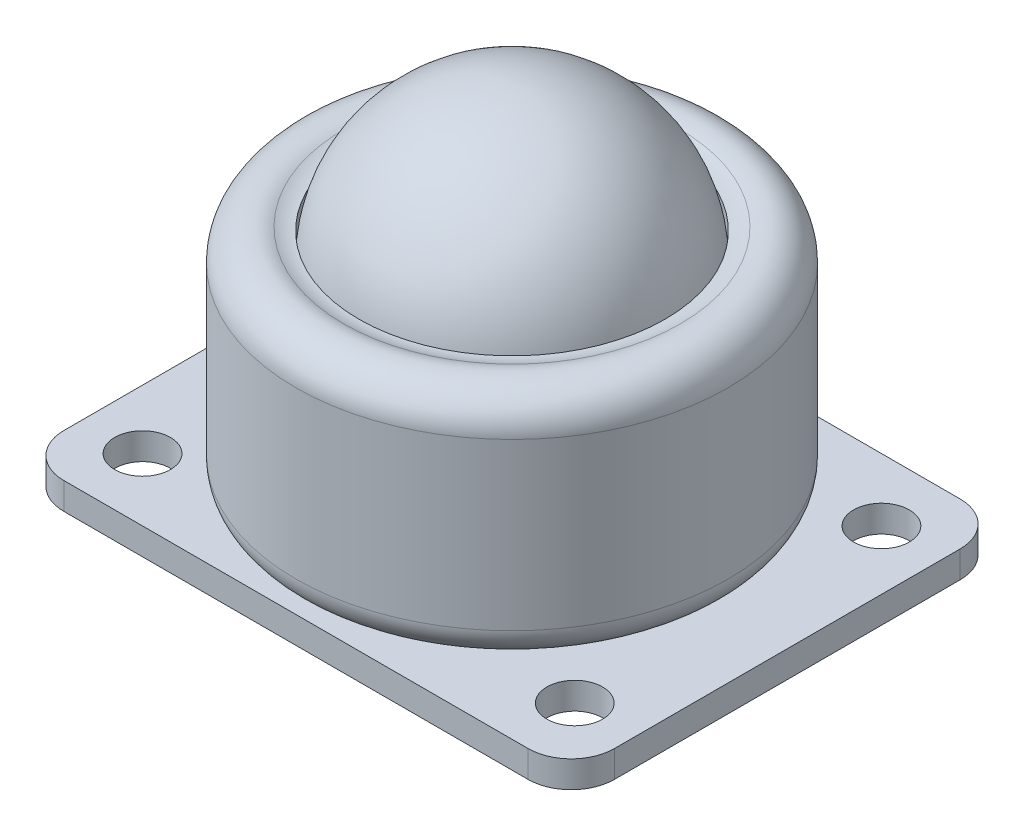
ISO-10303-21;
HEADER;
FILE_DESCRIPTION(('STEP AP214'),'2;1');
FILE_NAME('part.step','',(''),(''),'','','');
FILE_SCHEMA(('AUTOMOTIVE_DESIGN { 1 0 10303 214 1 1 1 1 }'));
ENDSEC;
DATA;
#1=APPLICATION_CONTEXT('core data for automotive mechanical design processes');
#2=APPLICATION_PROTOCOL_DEFINITION('international standard','automotive_design',2000,#1);
#3=PRODUCT_CONTEXT('',#1,'mechanical');
#4=PRODUCT('Part','Part','',(#3));
#5=PRODUCT_RELATED_PRODUCT_CATEGORY('part','',(#4));
#6=PRODUCT_DEFINITION_FORMATION('','',#4);
#7=PRODUCT_DEFINITION_CONTEXT('part definition',#1,'design');
#8=PRODUCT_DEFINITION('design','',#6,#7);
#9=PRODUCT_DEFINITION_SHAPE('','',#8);
#10=(LENGTH_UNIT() NAMED_UNIT(*) SI_UNIT(.MILLI.,.METRE.));
#11=(NAMED_UNIT(*) PLANE_ANGLE_UNIT() SI_UNIT($,.RADIAN.));
#12=(NAMED_UNIT(*) SI_UNIT($,.STERADIAN.) SOLID_ANGLE_UNIT());
#13=UNCERTAINTY_MEASURE_WITH_UNIT(LENGTH_MEASURE(1.E-05),#10,'distance_accuracy_value','');
#14=(GEOMETRIC_REPRESENTATION_CONTEXT(3) GLOBAL_UNCERTAINTY_ASSIGNED_CONTEXT((#13)) GLOBAL_UNIT_ASSIGNED_CONTEXT((#10,
#11,#12)) REPRESENTATION_CONTEXT('',''));
#15=CARTESIAN_POINT('',(0.,0.,0.));
#16=DIRECTION('',(0.,0.,1.));
#17=DIRECTION('',(1.,0.,0.));
#18=AXIS2_PLACEMENT_3D('',#15,#16,#17);
#19=CARTESIAN_POINT('',(0.,12.7,0.));
#20=DIRECTION('',(0.,1.,0.));
#21=DIRECTION('',(1.,0.,0.));
#22=AXIS2_PLACEMENT_3D('',#19,#20,#21);
#23=SPHERICAL_SURFACE('',#22,8.73125);
#24=CARTESIAN_POINT('',(0.,21.43125,0.));
#25=VERTEX_POINT('',#24);
#26=VERTEX_LOOP('',#25);
#27=FACE_BOUND('',#26,.T.);
#28=ADVANCED_FACE('F42',(#27),#23,.T.);
#29=CLOSED_SHELL('',(#28));
#30=MANIFOLD_SOLID_BREP('B2',#29);
#31=CARTESIAN_POINT('',(-12.303125,0.,0.));
#32=DIRECTION('',(0.,1.,0.));
#33=DIRECTION('',(0.,0.,1.));
#34=AXIS2_PLACEMENT_3D('',#31,#32,#33);
#35=PLANE('',#34);
#36=CARTESIAN_POINT('',(-12.303125,0.,8.73125));
#37=DIRECTION('',(0.,1.,0.));
#38=DIRECTION('',(0.,0.,1.));
#39=AXIS2_PLACEMENT_3D('',#36,#37,#38);
#40=CIRCLE('',#39,1.5875);
#41=CARTESIAN_POINT('',(-13.890625,0.,8.73125));
#42=VERTEX_POINT('',#41);
#43=EDGE_CURVE('E229',#42,#42,#40,.T.);
#44=ORIENTED_EDGE('',*,*,#43,.T.);
#45=EDGE_LOOP('',(#44));
#46=FACE_BOUND('',#45,.T.);
#47=CARTESIAN_POINT('',(12.303125,0.,-8.73125));
#48=DIRECTION('',(0.,1.,0.));
#49=DIRECTION('',(0.,0.,1.));
#50=AXIS2_PLACEMENT_3D('',#47,#48,#49);
#51=CIRCLE('',#50,1.5875);
#52=CARTESIAN_POINT('',(10.715625,0.,-8.73125));
#53=VERTEX_POINT('',#52);
#54=EDGE_CURVE('E233',#53,#53,#51,.T.);
#55=ORIENTED_EDGE('',*,*,#54,.T.);
#56=EDGE_LOOP('',(#55));
#57=FACE_BOUND('',#56,.T.);
#58=CARTESIAN_POINT('',(12.303125,0.,8.73125));
#59=DIRECTION('',(0.,1.,0.));
#60=DIRECTION('',(0.,0.,1.));
#61=AXIS2_PLACEMENT_3D('',#58,#59,#60);
#62=CIRCLE('',#61,1.5875);
#63=CARTESIAN_POINT('',(10.715625,0.,8.73125));
#64=VERTEX_POINT('',#63);
#65=EDGE_CURVE('E237',#64,#64,#62,.T.);
#66=ORIENTED_EDGE('',*,*,#65,.T.);
#67=EDGE_LOOP('',(#66));
#68=FACE_BOUND('',#67,.T.);
#69=CARTESIAN_POINT('',(-12.303125,0.,-8.73125));
#70=DIRECTION('',(0.,1.,0.));
#71=DIRECTION('',(0.,0.,1.));
#72=AXIS2_PLACEMENT_3D('',#69,#70,#71);
#73=CIRCLE('',#72,1.5875);
#74=CARTESIAN_POINT('',(-13.890625,0.,-8.73125));
#75=VERTEX_POINT('',#74);
#76=EDGE_CURVE('E147',#75,#75,#73,.T.);
#77=ORIENTED_EDGE('',*,*,#76,.T.);
#78=EDGE_LOOP('',(#77));
#79=FACE_BOUND('',#78,.T.);
#80=CARTESIAN_POINT('',(-13.2159375,0.,-9.8425));
#81=DIRECTION('',(0.,1.,0.));
#82=DIRECTION('',(0.,0.,1.));
#83=AXIS2_PLACEMENT_3D('',#80,#81,#82);
#84=CIRCLE('',#83,2.460625);
#85=CARTESIAN_POINT('',(-15.6765625,0.,-9.8425));
#86=VERTEX_POINT('',#85);
#87=CARTESIAN_POINT('',(-13.2159375,0.,-12.303125));
#88=VERTEX_POINT('',#87);
#89=EDGE_CURVE('E168',#86,#88,#84,.F.);
#90=ORIENTED_EDGE('',*,*,#89,.T.);
#91=DIRECTION('',(1.,0.,0.));
#92=VECTOR('',#91,1.);
#93=CARTESIAN_POINT('',(-13.2159375,0.,-12.303125));
#94=LINE('',#93,#92);
#95=CARTESIAN_POINT('',(13.2159375,0.,-12.303125));
#96=VERTEX_POINT('',#95);
#97=EDGE_CURVE('E182',#88,#96,#94,.T.);
#98=ORIENTED_EDGE('',*,*,#97,.T.);
#99=CARTESIAN_POINT('',(13.2159375,0.,-9.8425));
#100=DIRECTION('',(0.,1.,0.));
#101=DIRECTION('',(0.,0.,1.));
#102=AXIS2_PLACEMENT_3D('',#99,#100,#101);
#103=CIRCLE('',#102,2.460625);
#104=CARTESIAN_POINT('',(15.6765625,0.,-9.8425));
#105=VERTEX_POINT('',#104);
#106=EDGE_CURVE('E129',#96,#105,#103,.F.);
#107=ORIENTED_EDGE('',*,*,#106,.T.);
#108=DIRECTION('',(0.,0.,1.));
#109=VECTOR('',#108,1.);
#110=CARTESIAN_POINT('',(15.6765625,0.,-9.8425));
#111=LINE('',#110,#109);
#112=CARTESIAN_POINT('',(15.6765625,0.,9.8425));
#113=VERTEX_POINT('',#112);
#114=EDGE_CURVE('E187',#105,#113,#111,.T.);
#115=ORIENTED_EDGE('',*,*,#114,.T.);
#116=CARTESIAN_POINT('',(13.2159375,0.,9.8425));
#117=DIRECTION('',(0.,1.,0.));
#118=DIRECTION('',(0.,0.,1.));
#119=AXIS2_PLACEMENT_3D('',#116,#117,#118);
#120=CIRCLE('',#119,2.460625);
#121=CARTESIAN_POINT('',(13.2159375,0.,12.303125));
#122=VERTEX_POINT('',#121);
#123=EDGE_CURVE('E196',#113,#122,#120,.F.);
#124=ORIENTED_EDGE('',*,*,#123,.T.);
#125=DIRECTION('',(-1.,0.,0.));
#126=VECTOR('',#125,1.);
#127=CARTESIAN_POINT('',(-13.2159375,0.,12.303125));
#128=LINE('',#127,#126);
#129=CARTESIAN_POINT('',(-13.2159375,0.,12.303125));
#130=VERTEX_POINT('',#129);
#131=EDGE_CURVE('E194',#122,#130,#128,.T.);
#132=ORIENTED_EDGE('',*,*,#131,.T.);
#133=CARTESIAN_POINT('',(-13.2159375,0.,9.8425));
#134=DIRECTION('',(0.,1.,0.));
#135=DIRECTION('',(0.,0.,1.));
#136=AXIS2_PLACEMENT_3D('',#133,#134,#135);
#137=CIRCLE('',#136,2.460625);
#138=CARTESIAN_POINT('',(-15.6765625,0.,9.8425));
#139=VERTEX_POINT('',#138);
#140=EDGE_CURVE('E192',#130,#139,#137,.F.);
#141=ORIENTED_EDGE('',*,*,#140,.T.);
#142=DIRECTION('',(0.,0.,-1.));
#143=VECTOR('',#142,1.);
#144=CARTESIAN_POINT('',(-15.6765625,0.,-9.8425));
#145=LINE('',#144,#143);
#146=EDGE_CURVE('E76',#139,#86,#145,.T.);
#147=ORIENTED_EDGE('',*,*,#146,.T.);
#148=EDGE_LOOP('',(#90,#98,#107,#115,#124,#132,#141,#147));
#149=FACE_BOUND('',#148,.T.);
#150=CARTESIAN_POINT('',(0.,0.,0.));
#151=DIRECTION('',(0.,1.,0.));
#152=DIRECTION('',(0.,0.,1.));
#153=AXIS2_PLACEMENT_3D('',#150,#151,#152);
#154=CIRCLE('',#153,8.334375);
#155=CARTESIAN_POINT('',(0.,0.,8.334375));
#156=VERTEX_POINT('',#155);
#157=EDGE_CURVE('E40',#156,#156,#154,.T.);
#158=ORIENTED_EDGE('',*,*,#157,.T.);
#159=EDGE_LOOP('',(#158));
#160=FACE_BOUND('',#159,.T.);
#161=ADVANCED_FACE('F61',(#46,#57,#68,#79,#149,#160),#35,.F.);
#162=CARTESIAN_POINT('',(0.,14.2875,0.));
#163=DIRECTION('',(0.,1.,0.));
#164=DIRECTION('',(0.,0.,1.));
#165=AXIS2_PLACEMENT_3D('',#162,#163,#164);
#166=CYLINDRICAL_SURFACE('',#165,8.334375);
#167=ORIENTED_EDGE('',*,*,#157,.F.);
#168=EDGE_LOOP('',(#167));
#169=FACE_BOUND('',#168,.T.);
#170=CARTESIAN_POINT('',(0.,1.524,0.));
#171=DIRECTION('',(0.,1.,0.));
#172=DIRECTION('',(0.,0.,1.));
#173=AXIS2_PLACEMENT_3D('',#170,#171,#172);
#174=CIRCLE('',#173,8.334375);
#175=CARTESIAN_POINT('',(0.,1.524,8.334375));
#176=VERTEX_POINT('',#175);
#177=EDGE_CURVE('E69',#176,#176,#174,.T.);
#178=ORIENTED_EDGE('',*,*,#177,.T.);
#179=EDGE_LOOP('',(#178));
#180=FACE_BOUND('',#179,.T.);
#181=ADVANCED_FACE('F220',(#169,#180),#166,.F.);
#182=CARTESIAN_POINT('',(-8.334375,1.524,0.));
#183=DIRECTION('',(0.,-1.,0.));
#184=DIRECTION('',(0.,0.,-1.));
#185=AXIS2_PLACEMENT_3D('',#182,#183,#184);
#186=PLANE('',#185);
#187=CARTESIAN_POINT('',(-12.303125,1.524,8.73125));
#188=DIRECTION('',(0.,1.,0.));
#189=DIRECTION('',(-1.,0.,0.));
#190=AXIS2_PLACEMENT_3D('',#187,#188,#189);
#191=CIRCLE('',#190,1.5875);
#192=CARTESIAN_POINT('',(-13.890625,1.524,8.73125));
#193=VERTEX_POINT('',#192);
#194=EDGE_CURVE('E262',#193,#193,#191,.T.);
#195=ORIENTED_EDGE('',*,*,#194,.F.);
#196=EDGE_LOOP('',(#195));
#197=FACE_BOUND('',#196,.T.);
#198=CARTESIAN_POINT('',(12.303125,1.524,-8.73125));
#199=DIRECTION('',(0.,1.,0.));
#200=DIRECTION('',(-1.,0.,0.));
#201=AXIS2_PLACEMENT_3D('',#198,#199,#200);
#202=CIRCLE('',#201,1.5875);
#203=CARTESIAN_POINT('',(10.715625,1.524,-8.73125));
#204=VERTEX_POINT('',#203);
#205=EDGE_CURVE('E263',#204,#204,#202,.T.);
#206=ORIENTED_EDGE('',*,*,#205,.F.);
#207=EDGE_LOOP('',(#206));
#208=FACE_BOUND('',#207,.T.);
#209=CARTESIAN_POINT('',(12.303125,1.524,8.73125));
#210=DIRECTION('',(0.,1.,0.));
#211=DIRECTION('',(-1.,0.,0.));
#212=AXIS2_PLACEMENT_3D('',#209,#210,#211);
#213=CIRCLE('',#212,1.5875);
#214=CARTESIAN_POINT('',(10.715625,1.524,8.73125));
#215=VERTEX_POINT('',#214);
#216=EDGE_CURVE('E270',#215,#215,#213,.T.);
#217=ORIENTED_EDGE('',*,*,#216,.F.);
#218=EDGE_LOOP('',(#217));
#219=FACE_BOUND('',#218,.T.);
#220=CARTESIAN_POINT('',(-12.303125,1.524,-8.73125));
#221=DIRECTION('',(0.,1.,0.));
#222=DIRECTION('',(-1.,0.,0.));
#223=AXIS2_PLACEMENT_3D('',#220,#221,#222);
#224=CIRCLE('',#223,1.5875);
#225=CARTESIAN_POINT('',(-13.890625,1.524,-8.73125));
#226=VERTEX_POINT('',#225);
#227=EDGE_CURVE('E150',#226,#226,#224,.T.);
#228=ORIENTED_EDGE('',*,*,#227,.F.);
#229=EDGE_LOOP('',(#228));
#230=FACE_BOUND('',#229,.T.);
#231=ORIENTED_EDGE('',*,*,#177,.F.);
#232=EDGE_LOOP('',(#231));
#233=FACE_BOUND('',#232,.T.);
#234=CARTESIAN_POINT('',(-13.2159375,1.524,9.8425));
#235=DIRECTION('',(0.,1.,0.));
#236=DIRECTION('',(0.,0.,-1.));
#237=AXIS2_PLACEMENT_3D('',#234,#235,#236);
#238=CIRCLE('',#237,2.460625);
#239=CARTESIAN_POINT('',(-15.6765625,1.524,9.8425));
#240=VERTEX_POINT('',#239);
#241=CARTESIAN_POINT('',(-13.2159375,1.524,12.303125));
#242=VERTEX_POINT('',#241);
#243=EDGE_CURVE('E159',#240,#242,#238,.T.);
#244=ORIENTED_EDGE('',*,*,#243,.T.);
#245=DIRECTION('',(1.,0.,0.));
#246=VECTOR('',#245,1.);
#247=CARTESIAN_POINT('',(-13.2159375,1.524,12.303125));
#248=LINE('',#247,#246);
#249=CARTESIAN_POINT('',(13.2159375,1.524,12.303125));
#250=VERTEX_POINT('',#249);
#251=EDGE_CURVE('E161',#242,#250,#248,.T.);
#252=ORIENTED_EDGE('',*,*,#251,.T.);
#253=CARTESIAN_POINT('',(13.2159375,1.524,9.8425));
#254=DIRECTION('',(0.,1.,0.));
#255=DIRECTION('',(0.,0.,1.));
#256=AXIS2_PLACEMENT_3D('',#253,#254,#255);
#257=CIRCLE('',#256,2.460625);
#258=CARTESIAN_POINT('',(15.6765625,1.524,9.8425));
#259=VERTEX_POINT('',#258);
#260=EDGE_CURVE('E163',#250,#259,#257,.T.);
#261=ORIENTED_EDGE('',*,*,#260,.T.);
#262=DIRECTION('',(0.,0.,-1.));
#263=VECTOR('',#262,1.);
#264=CARTESIAN_POINT('',(15.6765625,1.524,-9.8425));
#265=LINE('',#264,#263);
#266=CARTESIAN_POINT('',(15.6765625,1.524,-9.8425));
#267=VERTEX_POINT('',#266);
#268=EDGE_CURVE('E132',#259,#267,#265,.T.);
#269=ORIENTED_EDGE('',*,*,#268,.T.);
#270=CARTESIAN_POINT('',(13.2159375,1.524,-9.8425));
#271=DIRECTION('',(0.,1.,0.));
#272=DIRECTION('',(0.,0.,1.));
#273=AXIS2_PLACEMENT_3D('',#270,#271,#272);
#274=CIRCLE('',#273,2.460625);
#275=CARTESIAN_POINT('',(13.2159375,1.524,-12.303125));
#276=VERTEX_POINT('',#275);
#277=EDGE_CURVE('E127',#267,#276,#274,.T.);
#278=ORIENTED_EDGE('',*,*,#277,.T.);
#279=DIRECTION('',(-1.,0.,0.));
#280=VECTOR('',#279,1.);
#281=CARTESIAN_POINT('',(-13.2159375,1.524,-12.303125));
#282=LINE('',#281,#280);
#283=CARTESIAN_POINT('',(-13.2159375,1.524,-12.303125));
#284=VERTEX_POINT('',#283);
#285=EDGE_CURVE('E135',#276,#284,#282,.T.);
#286=ORIENTED_EDGE('',*,*,#285,.T.);
#287=CARTESIAN_POINT('',(-13.2159375,1.524,-9.8425));
#288=DIRECTION('',(0.,1.,0.));
#289=DIRECTION('',(0.,0.,-1.));
#290=AXIS2_PLACEMENT_3D('',#287,#288,#289);
#291=CIRCLE('',#290,2.460625);
#292=CARTESIAN_POINT('',(-15.6765625,1.524,-9.8425));
#293=VERTEX_POINT('',#292);
#294=EDGE_CURVE('E141',#284,#293,#291,.T.);
#295=ORIENTED_EDGE('',*,*,#294,.T.);
#296=DIRECTION('',(0.,0.,1.));
#297=VECTOR('',#296,1.);
#298=CARTESIAN_POINT('',(-15.6765625,1.524,-9.8425));
#299=LINE('',#298,#297);
#300=EDGE_CURVE('E156',#293,#240,#299,.T.);
#301=ORIENTED_EDGE('',*,*,#300,.T.);
#302=EDGE_LOOP('',(#244,#252,#261,#269,#278,#286,#295,#301));
#303=FACE_BOUND('',#302,.T.);
#304=ADVANCED_FACE('F144',(#197,#208,#219,#230,#233,#303),#186,.F.);
#305=CARTESIAN_POINT('',(-13.2159375,-39.8558149625387,-12.303125));
#306=DIRECTION('',(0.,0.,-1.));
#307=DIRECTION('',(-1.,0.,0.));
#308=AXIS2_PLACEMENT_3D('',#305,#306,#307);
#309=PLANE('',#308);
#310=DIRECTION('',(0.,1.,0.));
#311=VECTOR('',#310,1.);
#312=CARTESIAN_POINT('',(-13.2159375,-39.8558149625387,-12.303125));
#313=LINE('',#312,#311);
#314=EDGE_CURVE('E131',#88,#284,#313,.T.);
#315=ORIENTED_EDGE('',*,*,#314,.T.);
#316=ORIENTED_EDGE('',*,*,#285,.F.);
#317=DIRECTION('',(0.,1.,0.));
#318=VECTOR('',#317,1.);
#319=CARTESIAN_POINT('',(13.2159375,-39.8558149625387,-12.303125));
#320=LINE('',#319,#318);
#321=EDGE_CURVE('E122',#96,#276,#320,.T.);
#322=ORIENTED_EDGE('',*,*,#321,.F.);
#323=ORIENTED_EDGE('',*,*,#97,.F.);
#324=EDGE_LOOP('',(#315,#316,#322,#323));
#325=FACE_BOUND('',#324,.T.);
#326=ADVANCED_FACE('F136',(#325),#309,.T.);
#327=CARTESIAN_POINT('',(-13.2159375,-39.8558149625387,12.303125));
#328=DIRECTION('',(0.,0.,1.));
#329=DIRECTION('',(1.,0.,0.));
#330=AXIS2_PLACEMENT_3D('',#327,#328,#329);
#331=PLANE('',#330);
#332=ORIENTED_EDGE('',*,*,#251,.F.);
#333=DIRECTION('',(0.,1.,0.));
#334=VECTOR('',#333,1.);
#335=CARTESIAN_POINT('',(-13.2159375,-39.8558149625387,12.303125));
#336=LINE('',#335,#334);
#337=EDGE_CURVE('E174',#130,#242,#336,.T.);
#338=ORIENTED_EDGE('',*,*,#337,.F.);
#339=ORIENTED_EDGE('',*,*,#131,.F.);
#340=DIRECTION('',(0.,1.,0.));
#341=VECTOR('',#340,1.);
#342=CARTESIAN_POINT('',(13.2159375,-39.8558149625387,12.303125));
#343=LINE('',#342,#341);
#344=EDGE_CURVE('E171',#122,#250,#343,.T.);
#345=ORIENTED_EDGE('',*,*,#344,.T.);
#346=EDGE_LOOP('',(#332,#338,#339,#345));
#347=FACE_BOUND('',#346,.T.);
#348=ADVANCED_FACE('F282',(#347),#331,.T.);
#349=CARTESIAN_POINT('',(-13.2159375,-39.8558149625387,-9.8425));
#350=DIRECTION('',(0.,1.,0.));
#351=DIRECTION('',(0.,0.,1.));
#352=AXIS2_PLACEMENT_3D('',#349,#350,#351);
#353=CYLINDRICAL_SURFACE('',#352,2.460625);
#354=ORIENTED_EDGE('',*,*,#89,.F.);
#355=DIRECTION('',(0.,1.,0.));
#356=VECTOR('',#355,1.);
#357=CARTESIAN_POINT('',(-15.6765625,-39.8558149625387,-9.8425));
#358=LINE('',#357,#356);
#359=EDGE_CURVE('E179',#86,#293,#358,.T.);
#360=ORIENTED_EDGE('',*,*,#359,.T.);
#361=ORIENTED_EDGE('',*,*,#294,.F.);
#362=ORIENTED_EDGE('',*,*,#314,.F.);
#363=EDGE_LOOP('',(#354,#360,#361,#362));
#364=FACE_BOUND('',#363,.T.);
#365=ADVANCED_FACE('F286',(#364),#353,.T.);
#366=CARTESIAN_POINT('',(-15.6765625,-39.8558149625387,-9.8425));
#367=DIRECTION('',(-1.,0.,0.));
#368=DIRECTION('',(0.,0.,1.));
#369=AXIS2_PLACEMENT_3D('',#366,#367,#368);
#370=PLANE('',#369);
#371=ORIENTED_EDGE('',*,*,#146,.F.);
#372=DIRECTION('',(0.,1.,0.));
#373=VECTOR('',#372,1.);
#374=CARTESIAN_POINT('',(-15.6765625,-39.8558149625387,9.8425));
#375=LINE('',#374,#373);
#376=EDGE_CURVE('E177',#139,#240,#375,.T.);
#377=ORIENTED_EDGE('',*,*,#376,.T.);
#378=ORIENTED_EDGE('',*,*,#300,.F.);
#379=ORIENTED_EDGE('',*,*,#359,.F.);
#380=EDGE_LOOP('',(#371,#377,#378,#379));
#381=FACE_BOUND('',#380,.T.);
#382=ADVANCED_FACE('F289',(#381),#370,.T.);
#383=CARTESIAN_POINT('',(-13.2159375,-39.8558149625387,9.8425));
#384=DIRECTION('',(0.,1.,0.));
#385=DIRECTION('',(0.,0.,1.));
#386=AXIS2_PLACEMENT_3D('',#383,#384,#385);
#387=CYLINDRICAL_SURFACE('',#386,2.460625);
#388=ORIENTED_EDGE('',*,*,#140,.F.);
#389=ORIENTED_EDGE('',*,*,#337,.T.);
#390=ORIENTED_EDGE('',*,*,#243,.F.);
#391=ORIENTED_EDGE('',*,*,#376,.F.);
#392=EDGE_LOOP('',(#388,#389,#390,#391));
#393=FACE_BOUND('',#392,.T.);
#394=ADVANCED_FACE('F216',(#393),#387,.T.);
#395=CARTESIAN_POINT('',(13.2159375,-39.8558149625387,9.8425));
#396=DIRECTION('',(0.,1.,0.));
#397=DIRECTION('',(0.,0.,1.));
#398=AXIS2_PLACEMENT_3D('',#395,#396,#397);
#399=CYLINDRICAL_SURFACE('',#398,2.460625);
#400=ORIENTED_EDGE('',*,*,#123,.F.);
#401=DIRECTION('',(0.,1.,0.));
#402=VECTOR('',#401,1.);
#403=CARTESIAN_POINT('',(15.6765625,-39.8558149625387,9.8425));
#404=LINE('',#403,#402);
#405=EDGE_CURVE('E169',#113,#259,#404,.T.);
#406=ORIENTED_EDGE('',*,*,#405,.T.);
#407=ORIENTED_EDGE('',*,*,#260,.F.);
#408=ORIENTED_EDGE('',*,*,#344,.F.);
#409=EDGE_LOOP('',(#400,#406,#407,#408));
#410=FACE_BOUND('',#409,.T.);
#411=ADVANCED_FACE('F205',(#410),#399,.T.);
#412=CARTESIAN_POINT('',(15.6765625,-39.8558149625387,-9.8425));
#413=DIRECTION('',(1.,0.,0.));
#414=DIRECTION('',(0.,0.,-1.));
#415=AXIS2_PLACEMENT_3D('',#412,#413,#414);
#416=PLANE('',#415);
#417=ORIENTED_EDGE('',*,*,#114,.F.);
#418=DIRECTION('',(0.,1.,0.));
#419=VECTOR('',#418,1.);
#420=CARTESIAN_POINT('',(15.6765625,-39.8558149625387,-9.8425));
#421=LINE('',#420,#419);
#422=EDGE_CURVE('E166',#105,#267,#421,.T.);
#423=ORIENTED_EDGE('',*,*,#422,.T.);
#424=ORIENTED_EDGE('',*,*,#268,.F.);
#425=ORIENTED_EDGE('',*,*,#405,.F.);
#426=EDGE_LOOP('',(#417,#423,#424,#425));
#427=FACE_BOUND('',#426,.T.);
#428=ADVANCED_FACE('F207',(#427),#416,.T.);
#429=CARTESIAN_POINT('',(13.2159375,-39.8558149625387,-9.8425));
#430=DIRECTION('',(0.,1.,0.));
#431=DIRECTION('',(0.,0.,1.));
#432=AXIS2_PLACEMENT_3D('',#429,#430,#431);
#433=CYLINDRICAL_SURFACE('',#432,2.460625);
#434=ORIENTED_EDGE('',*,*,#106,.F.);
#435=ORIENTED_EDGE('',*,*,#321,.T.);
#436=ORIENTED_EDGE('',*,*,#277,.F.);
#437=ORIENTED_EDGE('',*,*,#422,.F.);
#438=EDGE_LOOP('',(#434,#435,#436,#437));
#439=FACE_BOUND('',#438,.T.);
#440=ADVANCED_FACE('F124',(#439),#433,.T.);
#441=CARTESIAN_POINT('',(-12.303125,-3.96875,-8.73125));
#442=DIRECTION('',(0.,1.,0.));
#443=DIRECTION('',(-1.,0.,0.));
#444=AXIS2_PLACEMENT_3D('',#441,#442,#443);
#445=CYLINDRICAL_SURFACE('',#444,1.5875);
#446=CARTESIAN_POINT('',(-13.890625,1.524,-8.73125));
#447=CARTESIAN_POINT('',(-13.890625,1.508125,-8.73125));
#448=CARTESIAN_POINT('',(-13.890625,1.49225,-8.73125));
#449=CARTESIAN_POINT('',(-13.890625,1.4605,-8.73125));
#450=CARTESIAN_POINT('',(-13.890625,1.444625,-8.73125));
#451=CARTESIAN_POINT('',(-13.890625,1.412875,-8.73125));
#452=CARTESIAN_POINT('',(-13.890625,1.397,-8.73125));
#453=CARTESIAN_POINT('',(-13.890625,1.36525,-8.73125));
#454=CARTESIAN_POINT('',(-13.890625,1.349375,-8.73125));
#455=CARTESIAN_POINT('',(-13.890625,1.317625,-8.73125));
#456=CARTESIAN_POINT('',(-13.890625,1.30175,-8.73125));
#457=CARTESIAN_POINT('',(-13.890625,1.27,-8.73125));
#458=CARTESIAN_POINT('',(-13.890625,1.254125,-8.73125));
#459=CARTESIAN_POINT('',(-13.890625,1.222375,-8.73125));
#460=CARTESIAN_POINT('',(-13.890625,1.2065,-8.73125));
#461=CARTESIAN_POINT('',(-13.890625,1.17475,-8.73125));
#462=CARTESIAN_POINT('',(-13.890625,1.158875,-8.73125));
#463=CARTESIAN_POINT('',(-13.890625,1.127125,-8.73125));
#464=CARTESIAN_POINT('',(-13.890625,1.11125,-8.73125));
#465=CARTESIAN_POINT('',(-13.890625,1.0795,-8.73125));
#466=CARTESIAN_POINT('',(-13.890625,1.063625,-8.73125));
#467=CARTESIAN_POINT('',(-13.890625,1.031875,-8.73125));
#468=CARTESIAN_POINT('',(-13.890625,1.016,-8.73125));
#469=CARTESIAN_POINT('',(-13.890625,0.98425,-8.73125));
#470=CARTESIAN_POINT('',(-13.890625,0.968375,-8.73125));
#471=CARTESIAN_POINT('',(-13.890625,0.936625,-8.73125));
#472=CARTESIAN_POINT('',(-13.890625,0.92075,-8.73125));
#473=CARTESIAN_POINT('',(-13.890625,0.888999999999999,-8.73125));
#474=CARTESIAN_POINT('',(-13.890625,0.873124999999999,-8.73125));
#475=CARTESIAN_POINT('',(-13.890625,0.841375,-8.73125));
#476=CARTESIAN_POINT('',(-13.890625,0.8255,-8.73125));
#477=CARTESIAN_POINT('',(-13.890625,0.79375,-8.73125));
#478=CARTESIAN_POINT('',(-13.890625,0.777875,-8.73125));
#479=CARTESIAN_POINT('',(-13.890625,0.746125,-8.73125));
#480=CARTESIAN_POINT('',(-13.890625,0.73025,-8.73125));
#481=CARTESIAN_POINT('',(-13.890625,0.6985,-8.73125));
#482=CARTESIAN_POINT('',(-13.890625,0.682625,-8.73125));
#483=CARTESIAN_POINT('',(-13.890625,0.650875,-8.73125));
#484=CARTESIAN_POINT('',(-13.890625,0.635,-8.73125));
#485=CARTESIAN_POINT('',(-13.890625,0.60325,-8.73125));
#486=CARTESIAN_POINT('',(-13.890625,0.587374999999999,-8.73125));
#487=CARTESIAN_POINT('',(-13.890625,0.555624999999999,-8.73125));
#488=CARTESIAN_POINT('',(-13.890625,0.539749999999999,-8.73125));
#489=CARTESIAN_POINT('',(-13.890625,0.507999999999999,-8.73125));
#490=CARTESIAN_POINT('',(-13.890625,0.492124999999999,-8.73125));
#491=CARTESIAN_POINT('',(-13.890625,0.460374999999999,-8.73125));
#492=CARTESIAN_POINT('',(-13.890625,0.444499999999999,-8.73125));
#493=CARTESIAN_POINT('',(-13.890625,0.412749999999999,-8.73125));
#494=CARTESIAN_POINT('',(-13.890625,0.396874999999999,-8.73125));
#495=CARTESIAN_POINT('',(-13.890625,0.365124999999999,-8.73125));
#496=CARTESIAN_POINT('',(-13.890625,0.349249999999999,-8.73125));
#497=CARTESIAN_POINT('',(-13.890625,0.317499999999999,-8.73125));
#498=CARTESIAN_POINT('',(-13.890625,0.301624999999999,-8.73125));
#499=CARTESIAN_POINT('',(-13.890625,0.269874999999999,-8.73125));
#500=CARTESIAN_POINT('',(-13.890625,0.253999999999999,-8.73125));
#501=CARTESIAN_POINT('',(-13.890625,0.222249999999999,-8.73125));
#502=CARTESIAN_POINT('',(-13.890625,0.206374999999999,-8.73125));
#503=CARTESIAN_POINT('',(-13.890625,0.174624999999999,-8.73125));
#504=CARTESIAN_POINT('',(-13.890625,0.158749999999999,-8.73125));
#505=CARTESIAN_POINT('',(-13.890625,0.126999999999999,-8.73125));
#506=CARTESIAN_POINT('',(-13.890625,0.111124999999998,-8.73125));
#507=CARTESIAN_POINT('',(-13.890625,0.0793749999999981,-8.73125));
#508=CARTESIAN_POINT('',(-13.890625,0.0634999999999982,-8.73125));
#509=CARTESIAN_POINT('',(-13.890625,0.0317499999999982,-8.73125));
#510=CARTESIAN_POINT('',(-13.890625,0.0158749999999983,-8.73125));
#511=CARTESIAN_POINT('',(-13.890625,0.,-8.73125));
#512=B_SPLINE_CURVE_WITH_KNOTS('',3,(#446,#447,#448,#449,#450,#451,#452,#453,#454,#455,#456,
#457,#458,#459,#460,#461,#462,#463,#464,#465,#466,#467,#468,#469,#470,#471,#472,#473,#474,#475,
#476,#477,#478,#479,#480,#481,#482,#483,#484,#485,#486,#487,#488,#489,#490,#491,#492,#493,#494,
#495,#496,#497,#498,#499,#500,#501,#502,#503,#504,#505,#506,#507,#508,#509,#510,#511),
.UNSPECIFIED.,.F.,.F.,(4,2,2,2,2,2,2,2,2,2,2,2,2,2,2,2,2,2,2,2,2,2,2,2,2,2,2,2,2,2,2,2,4),(0.,
0.0476249999999999,0.0952499999999998,0.142875000000001,0.190500000000001,0.238125,0.28575,
0.333375,0.381000000000001,0.428625000000001,0.476250000000001,0.523875000000001,
0.571500000000001,0.619125000000002,0.666750000000002,0.714375000000001,0.762000000000001,
0.809625000000001,0.857250000000001,0.904875000000001,0.952500000000002,1.000125,1.04775,
1.095375,1.143,1.190625,1.23825,1.285875,1.3335,1.381125,1.42875,1.476375,1.524),.UNSPECIFIED.);
#513=EDGE_CURVE('BSEAM214',#226,#75,#512,.T.);
#514=ORIENTED_EDGE('',*,*,#227,.T.);
#515=ORIENTED_EDGE('',*,*,#76,.F.);
#516=ORIENTED_EDGE('',*,*,#513,.T.);
#517=ORIENTED_EDGE('',*,*,#513,.F.);
#518=EDGE_LOOP('',(#514,#516,#515,#517));
#519=FACE_BOUND('',#518,.T.);
#520=ADVANCED_FACE('F214',(#519),#445,.F.);
#521=CARTESIAN_POINT('',(12.303125,-3.96875,8.73125));
#522=DIRECTION('',(0.,1.,0.));
#523=DIRECTION('',(-1.,0.,0.));
#524=AXIS2_PLACEMENT_3D('',#521,#522,#523);
#525=CYLINDRICAL_SURFACE('',#524,1.5875);
#526=CARTESIAN_POINT('',(10.715625,1.524,8.73125));
#527=CARTESIAN_POINT('',(10.715625,1.508125,8.73125));
#528=CARTESIAN_POINT('',(10.715625,1.49225,8.73125));
#529=CARTESIAN_POINT('',(10.715625,1.4605,8.73125));
#530=CARTESIAN_POINT('',(10.715625,1.444625,8.73125));
#531=CARTESIAN_POINT('',(10.715625,1.412875,8.73125));
#532=CARTESIAN_POINT('',(10.715625,1.397,8.73125));
#533=CARTESIAN_POINT('',(10.715625,1.36525,8.73125));
#534=CARTESIAN_POINT('',(10.715625,1.349375,8.73125));
#535=CARTESIAN_POINT('',(10.715625,1.317625,8.73125));
#536=CARTESIAN_POINT('',(10.715625,1.30175,8.73125));
#537=CARTESIAN_POINT('',(10.715625,1.27,8.73125));
#538=CARTESIAN_POINT('',(10.715625,1.254125,8.73125));
#539=CARTESIAN_POINT('',(10.715625,1.222375,8.73125));
#540=CARTESIAN_POINT('',(10.715625,1.2065,8.73125));
#541=CARTESIAN_POINT('',(10.715625,1.17475,8.73125));
#542=CARTESIAN_POINT('',(10.715625,1.158875,8.73125));
#543=CARTESIAN_POINT('',(10.715625,1.127125,8.73125));
#544=CARTESIAN_POINT('',(10.715625,1.11125,8.73125));
#545=CARTESIAN_POINT('',(10.715625,1.0795,8.73125));
#546=CARTESIAN_POINT('',(10.715625,1.063625,8.73125));
#547=CARTESIAN_POINT('',(10.715625,1.031875,8.73125));
#548=CARTESIAN_POINT('',(10.715625,1.016,8.73125));
#549=CARTESIAN_POINT('',(10.715625,0.984249999999999,8.73125));
#550=CARTESIAN_POINT('',(10.715625,0.968374999999999,8.73125));
#551=CARTESIAN_POINT('',(10.715625,0.936624999999999,8.73125));
#552=CARTESIAN_POINT('',(10.715625,0.920749999999999,8.73125));
#553=CARTESIAN_POINT('',(10.715625,0.888999999999999,8.73125));
#554=CARTESIAN_POINT('',(10.715625,0.873124999999999,8.73125));
#555=CARTESIAN_POINT('',(10.715625,0.841374999999999,8.73125));
#556=CARTESIAN_POINT('',(10.715625,0.825499999999999,8.73125));
#557=CARTESIAN_POINT('',(10.715625,0.793749999999999,8.73125));
#558=CARTESIAN_POINT('',(10.715625,0.777874999999999,8.73125));
#559=CARTESIAN_POINT('',(10.715625,0.746124999999999,8.73125));
#560=CARTESIAN_POINT('',(10.715625,0.730249999999999,8.73125));
#561=CARTESIAN_POINT('',(10.715625,0.698499999999999,8.73125));
#562=CARTESIAN_POINT('',(10.715625,0.682624999999999,8.73125));
#563=CARTESIAN_POINT('',(10.715625,0.650874999999999,8.73125));
#564=CARTESIAN_POINT('',(10.715625,0.634999999999999,8.73125));
#565=CARTESIAN_POINT('',(10.715625,0.603249999999999,8.73125));
#566=CARTESIAN_POINT('',(10.715625,0.587374999999999,8.73125));
#567=CARTESIAN_POINT('',(10.715625,0.555624999999999,8.73125));
#568=CARTESIAN_POINT('',(10.715625,0.539749999999999,8.73125));
#569=CARTESIAN_POINT('',(10.715625,0.507999999999998,8.73125));
#570=CARTESIAN_POINT('',(10.715625,0.492124999999998,8.73125));
#571=CARTESIAN_POINT('',(10.715625,0.460374999999998,8.73125));
#572=CARTESIAN_POINT('',(10.715625,0.444499999999998,8.73125));
#573=CARTESIAN_POINT('',(10.715625,0.412749999999998,8.73125));
#574=CARTESIAN_POINT('',(10.715625,0.396874999999999,8.73125));
#575=CARTESIAN_POINT('',(10.715625,0.365124999999999,8.73125));
#576=CARTESIAN_POINT('',(10.715625,0.349249999999999,8.73125));
#577=CARTESIAN_POINT('',(10.715625,0.317499999999999,8.73125));
#578=CARTESIAN_POINT('',(10.715625,0.301624999999999,8.73125));
#579=CARTESIAN_POINT('',(10.715625,0.269874999999999,8.73125));
#580=CARTESIAN_POINT('',(10.715625,0.253999999999999,8.73125));
#581=CARTESIAN_POINT('',(10.715625,0.222249999999999,8.73125));
#582=CARTESIAN_POINT('',(10.715625,0.206374999999998,8.73125));
#583=CARTESIAN_POINT('',(10.715625,0.174624999999998,8.73125));
#584=CARTESIAN_POINT('',(10.715625,0.158749999999999,8.73125));
#585=CARTESIAN_POINT('',(10.715625,0.126999999999999,8.73125));
#586=CARTESIAN_POINT('',(10.715625,0.111124999999998,8.73125));
#587=CARTESIAN_POINT('',(10.715625,0.0793749999999981,8.73125));
#588=CARTESIAN_POINT('',(10.715625,0.0634999999999982,8.73125));
#589=CARTESIAN_POINT('',(10.715625,0.0317499999999982,8.73125));
#590=CARTESIAN_POINT('',(10.715625,0.0158749999999983,8.73125));
#591=CARTESIAN_POINT('',(10.715625,0.,8.73125));
#592=B_SPLINE_CURVE_WITH_KNOTS('',3,(#526,#527,#528,#529,#530,#531,#532,#533,#534,#535,#536,
#537,#538,#539,#540,#541,#542,#543,#544,#545,#546,#547,#548,#549,#550,#551,#552,#553,#554,#555,
#556,#557,#558,#559,#560,#561,#562,#563,#564,#565,#566,#567,#568,#569,#570,#571,#572,#573,#574,
#575,#576,#577,#578,#579,#580,#581,#582,#583,#584,#585,#586,#587,#588,#589,#590,#591),
.UNSPECIFIED.,.F.,.F.,(4,2,2,2,2,2,2,2,2,2,2,2,2,2,2,2,2,2,2,2,2,2,2,2,2,2,2,2,2,2,2,2,4),(0.,
0.0476249999999999,0.0952499999999998,0.142875,0.1905,0.238125,0.28575,0.333375,0.381,0.428625,
0.47625,0.523875,0.571500000000001,0.619125000000001,0.666750000000001,0.714375000000001,
0.762000000000001,0.809625,0.85725,0.904875,0.9525,1.000125,1.04775,1.095375,1.143,1.190625,
1.23825,1.285875,1.3335,1.381125,1.42875,1.476375,1.524),.UNSPECIFIED.);
#593=EDGE_CURVE('BSEAM241',#215,#64,#592,.T.);
#594=ORIENTED_EDGE('',*,*,#216,.T.);
#595=ORIENTED_EDGE('',*,*,#65,.F.);
#596=ORIENTED_EDGE('',*,*,#593,.T.);
#597=ORIENTED_EDGE('',*,*,#593,.F.);
#598=EDGE_LOOP('',(#594,#596,#595,#597));
#599=FACE_BOUND('',#598,.T.);
#600=ADVANCED_FACE('F241',(#599),#525,.F.);
#601=CARTESIAN_POINT('',(12.303125,-3.96875,-8.73125));
#602=DIRECTION('',(0.,1.,0.));
#603=DIRECTION('',(-1.,0.,0.));
#604=AXIS2_PLACEMENT_3D('',#601,#602,#603);
#605=CYLINDRICAL_SURFACE('',#604,1.5875);
#606=CARTESIAN_POINT('',(10.715625,1.524,-8.73125));
#607=CARTESIAN_POINT('',(10.715625,1.508125,-8.73125));
#608=CARTESIAN_POINT('',(10.715625,1.49225,-8.73125));
#609=CARTESIAN_POINT('',(10.715625,1.4605,-8.73125));
#610=CARTESIAN_POINT('',(10.715625,1.444625,-8.73125));
#611=CARTESIAN_POINT('',(10.715625,1.412875,-8.73125));
#612=CARTESIAN_POINT('',(10.715625,1.397,-8.73125));
#613=CARTESIAN_POINT('',(10.715625,1.36525,-8.73125));
#614=CARTESIAN_POINT('',(10.715625,1.349375,-8.73125));
#615=CARTESIAN_POINT('',(10.715625,1.317625,-8.73125));
#616=CARTESIAN_POINT('',(10.715625,1.30175,-8.73125));
#617=CARTESIAN_POINT('',(10.715625,1.27,-8.73125));
#618=CARTESIAN_POINT('',(10.715625,1.254125,-8.73125));
#619=CARTESIAN_POINT('',(10.715625,1.222375,-8.73125));
#620=CARTESIAN_POINT('',(10.715625,1.2065,-8.73125));
#621=CARTESIAN_POINT('',(10.715625,1.17475,-8.73125));
#622=CARTESIAN_POINT('',(10.715625,1.158875,-8.73125));
#623=CARTESIAN_POINT('',(10.715625,1.127125,-8.73125));
#624=CARTESIAN_POINT('',(10.715625,1.11125,-8.73125));
#625=CARTESIAN_POINT('',(10.715625,1.0795,-8.73125));
#626=CARTESIAN_POINT('',(10.715625,1.063625,-8.73125));
#627=CARTESIAN_POINT('',(10.715625,1.031875,-8.73125));
#628=CARTESIAN_POINT('',(10.715625,1.016,-8.73125));
#629=CARTESIAN_POINT('',(10.715625,0.984249999999999,-8.73125));
#630=CARTESIAN_POINT('',(10.715625,0.968374999999999,-8.73125));
#631=CARTESIAN_POINT('',(10.715625,0.936624999999999,-8.73125));
#632=CARTESIAN_POINT('',(10.715625,0.920749999999999,-8.73125));
#633=CARTESIAN_POINT('',(10.715625,0.888999999999999,-8.73125));
#634=CARTESIAN_POINT('',(10.715625,0.873124999999999,-8.73125));
#635=CARTESIAN_POINT('',(10.715625,0.841374999999999,-8.73125));
#636=CARTESIAN_POINT('',(10.715625,0.825499999999999,-8.73125));
#637=CARTESIAN_POINT('',(10.715625,0.793749999999999,-8.73125));
#638=CARTESIAN_POINT('',(10.715625,0.777874999999999,-8.73125));
#639=CARTESIAN_POINT('',(10.715625,0.746124999999999,-8.73125));
#640=CARTESIAN_POINT('',(10.715625,0.730249999999999,-8.73125));
#641=CARTESIAN_POINT('',(10.715625,0.698499999999999,-8.73125));
#642=CARTESIAN_POINT('',(10.715625,0.682624999999999,-8.73125));
#643=CARTESIAN_POINT('',(10.715625,0.650874999999999,-8.73125));
#644=CARTESIAN_POINT('',(10.715625,0.634999999999999,-8.73125));
#645=CARTESIAN_POINT('',(10.715625,0.603249999999999,-8.73125));
#646=CARTESIAN_POINT('',(10.715625,0.587374999999999,-8.73125));
#647=CARTESIAN_POINT('',(10.715625,0.555624999999999,-8.73125));
#648=CARTESIAN_POINT('',(10.715625,0.539749999999999,-8.73125));
#649=CARTESIAN_POINT('',(10.715625,0.507999999999998,-8.73125));
#650=CARTESIAN_POINT('',(10.715625,0.492124999999998,-8.73125));
#651=CARTESIAN_POINT('',(10.715625,0.460374999999998,-8.73125));
#652=CARTESIAN_POINT('',(10.715625,0.444499999999998,-8.73125));
#653=CARTESIAN_POINT('',(10.715625,0.412749999999998,-8.73125));
#654=CARTESIAN_POINT('',(10.715625,0.396874999999999,-8.73125));
#655=CARTESIAN_POINT('',(10.715625,0.365124999999999,-8.73125));
#656=CARTESIAN_POINT('',(10.715625,0.349249999999999,-8.73125));
#657=CARTESIAN_POINT('',(10.715625,0.317499999999999,-8.73125));
#658=CARTESIAN_POINT('',(10.715625,0.301624999999999,-8.73125));
#659=CARTESIAN_POINT('',(10.715625,0.269874999999999,-8.73125));
#660=CARTESIAN_POINT('',(10.715625,0.253999999999999,-8.73125));
#661=CARTESIAN_POINT('',(10.715625,0.222249999999999,-8.73125));
#662=CARTESIAN_POINT('',(10.715625,0.206374999999998,-8.73125));
#663=CARTESIAN_POINT('',(10.715625,0.174624999999998,-8.73125));
#664=CARTESIAN_POINT('',(10.715625,0.158749999999999,-8.73125));
#665=CARTESIAN_POINT('',(10.715625,0.126999999999999,-8.73125));
#666=CARTESIAN_POINT('',(10.715625,0.111124999999998,-8.73125));
#667=CARTESIAN_POINT('',(10.715625,0.0793749999999981,-8.73125));
#668=CARTESIAN_POINT('',(10.715625,0.0634999999999982,-8.73125));
#669=CARTESIAN_POINT('',(10.715625,0.0317499999999982,-8.73125));
#670=CARTESIAN_POINT('',(10.715625,0.0158749999999983,-8.73125));
#671=CARTESIAN_POINT('',(10.715625,0.,-8.73125));
#672=B_SPLINE_CURVE_WITH_KNOTS('',3,(#606,#607,#608,#609,#610,#611,#612,#613,#614,#615,#616,
#617,#618,#619,#620,#621,#622,#623,#624,#625,#626,#627,#628,#629,#630,#631,#632,#633,#634,#635,
#636,#637,#638,#639,#640,#641,#642,#643,#644,#645,#646,#647,#648,#649,#650,#651,#652,#653,#654,
#655,#656,#657,#658,#659,#660,#661,#662,#663,#664,#665,#666,#667,#668,#669,#670,#671),
.UNSPECIFIED.,.F.,.F.,(4,2,2,2,2,2,2,2,2,2,2,2,2,2,2,2,2,2,2,2,2,2,2,2,2,2,2,2,2,2,2,2,4),(0.,
0.0476249999999999,0.0952499999999998,0.142875,0.1905,0.238125,0.28575,0.333375,0.381,0.428625,
0.47625,0.523875,0.571500000000001,0.619125000000001,0.666750000000001,0.714375000000001,
0.762000000000001,0.809625,0.85725,0.904875,0.9525,1.000125,1.04775,1.095375,1.143,1.190625,
1.23825,1.285875,1.3335,1.381125,1.42875,1.476375,1.524),.UNSPECIFIED.);
#673=EDGE_CURVE('BSEAM246',#204,#53,#672,.T.);
#674=ORIENTED_EDGE('',*,*,#205,.T.);
#675=ORIENTED_EDGE('',*,*,#54,.F.);
#676=ORIENTED_EDGE('',*,*,#673,.T.);
#677=ORIENTED_EDGE('',*,*,#673,.F.);
#678=EDGE_LOOP('',(#674,#676,#675,#677));
#679=FACE_BOUND('',#678,.T.);
#680=ADVANCED_FACE('F246',(#679),#605,.F.);
#681=CARTESIAN_POINT('',(-12.303125,-3.96875,8.73125));
#682=DIRECTION('',(0.,1.,0.));
#683=DIRECTION('',(-1.,0.,0.));
#684=AXIS2_PLACEMENT_3D('',#681,#682,#683);
#685=CYLINDRICAL_SURFACE('',#684,1.5875);
#686=CARTESIAN_POINT('',(-13.890625,1.524,8.73125));
#687=CARTESIAN_POINT('',(-13.890625,1.508125,8.73125));
#688=CARTESIAN_POINT('',(-13.890625,1.49225,8.73125));
#689=CARTESIAN_POINT('',(-13.890625,1.4605,8.73125));
#690=CARTESIAN_POINT('',(-13.890625,1.444625,8.73125));
#691=CARTESIAN_POINT('',(-13.890625,1.412875,8.73125));
#692=CARTESIAN_POINT('',(-13.890625,1.397,8.73125));
#693=CARTESIAN_POINT('',(-13.890625,1.36525,8.73125));
#694=CARTESIAN_POINT('',(-13.890625,1.349375,8.73125));
#695=CARTESIAN_POINT('',(-13.890625,1.317625,8.73125));
#696=CARTESIAN_POINT('',(-13.890625,1.30175,8.73125));
#697=CARTESIAN_POINT('',(-13.890625,1.27,8.73125));
#698=CARTESIAN_POINT('',(-13.890625,1.254125,8.73125));
#699=CARTESIAN_POINT('',(-13.890625,1.222375,8.73125));
#700=CARTESIAN_POINT('',(-13.890625,1.2065,8.73125));
#701=CARTESIAN_POINT('',(-13.890625,1.17475,8.73125));
#702=CARTESIAN_POINT('',(-13.890625,1.158875,8.73125));
#703=CARTESIAN_POINT('',(-13.890625,1.127125,8.73125));
#704=CARTESIAN_POINT('',(-13.890625,1.11125,8.73125));
#705=CARTESIAN_POINT('',(-13.890625,1.0795,8.73125));
#706=CARTESIAN_POINT('',(-13.890625,1.063625,8.73125));
#707=CARTESIAN_POINT('',(-13.890625,1.031875,8.73125));
#708=CARTESIAN_POINT('',(-13.890625,1.016,8.73125));
#709=CARTESIAN_POINT('',(-13.890625,0.98425,8.73125));
#710=CARTESIAN_POINT('',(-13.890625,0.968375,8.73125));
#711=CARTESIAN_POINT('',(-13.890625,0.936625,8.73125));
#712=CARTESIAN_POINT('',(-13.890625,0.92075,8.73125));
#713=CARTESIAN_POINT('',(-13.890625,0.888999999999999,8.73125));
#714=CARTESIAN_POINT('',(-13.890625,0.873124999999999,8.73125));
#715=CARTESIAN_POINT('',(-13.890625,0.841375,8.73125));
#716=CARTESIAN_POINT('',(-13.890625,0.8255,8.73125));
#717=CARTESIAN_POINT('',(-13.890625,0.79375,8.73125));
#718=CARTESIAN_POINT('',(-13.890625,0.777875,8.73125));
#719=CARTESIAN_POINT('',(-13.890625,0.746125,8.73125));
#720=CARTESIAN_POINT('',(-13.890625,0.73025,8.73125));
#721=CARTESIAN_POINT('',(-13.890625,0.6985,8.73125));
#722=CARTESIAN_POINT('',(-13.890625,0.682625,8.73125));
#723=CARTESIAN_POINT('',(-13.890625,0.650875,8.73125));
#724=CARTESIAN_POINT('',(-13.890625,0.635,8.73125));
#725=CARTESIAN_POINT('',(-13.890625,0.60325,8.73125));
#726=CARTESIAN_POINT('',(-13.890625,0.587374999999999,8.73125));
#727=CARTESIAN_POINT('',(-13.890625,0.555624999999999,8.73125));
#728=CARTESIAN_POINT('',(-13.890625,0.539749999999999,8.73125));
#729=CARTESIAN_POINT('',(-13.890625,0.507999999999999,8.73125));
#730=CARTESIAN_POINT('',(-13.890625,0.492124999999999,8.73125));
#731=CARTESIAN_POINT('',(-13.890625,0.460374999999999,8.73125));
#732=CARTESIAN_POINT('',(-13.890625,0.444499999999999,8.73125));
#733=CARTESIAN_POINT('',(-13.890625,0.412749999999999,8.73125));
#734=CARTESIAN_POINT('',(-13.890625,0.396874999999999,8.73125));
#735=CARTESIAN_POINT('',(-13.890625,0.365124999999999,8.73125));
#736=CARTESIAN_POINT('',(-13.890625,0.349249999999999,8.73125));
#737=CARTESIAN_POINT('',(-13.890625,0.317499999999999,8.73125));
#738=CARTESIAN_POINT('',(-13.890625,0.301624999999999,8.73125));
#739=CARTESIAN_POINT('',(-13.890625,0.269874999999999,8.73125));
#740=CARTESIAN_POINT('',(-13.890625,0.253999999999999,8.73125));
#741=CARTESIAN_POINT('',(-13.890625,0.222249999999999,8.73125));
#742=CARTESIAN_POINT('',(-13.890625,0.206374999999999,8.73125));
#743=CARTESIAN_POINT('',(-13.890625,0.174624999999999,8.73125));
#744=CARTESIAN_POINT('',(-13.890625,0.158749999999999,8.73125));
#745=CARTESIAN_POINT('',(-13.890625,0.126999999999999,8.73125));
#746=CARTESIAN_POINT('',(-13.890625,0.111124999999998,8.73125));
#747=CARTESIAN_POINT('',(-13.890625,0.0793749999999981,8.73125));
#748=CARTESIAN_POINT('',(-13.890625,0.0634999999999982,8.73125));
#749=CARTESIAN_POINT('',(-13.890625,0.0317499999999982,8.73125));
#750=CARTESIAN_POINT('',(-13.890625,0.0158749999999983,8.73125));
#751=CARTESIAN_POINT('',(-13.890625,0.,8.73125));
#752=B_SPLINE_CURVE_WITH_KNOTS('',3,(#686,#687,#688,#689,#690,#691,#692,#693,#694,#695,#696,
#697,#698,#699,#700,#701,#702,#703,#704,#705,#706,#707,#708,#709,#710,#711,#712,#713,#714,#715,
#716,#717,#718,#719,#720,#721,#722,#723,#724,#725,#726,#727,#728,#729,#730,#731,#732,#733,#734,
#735,#736,#737,#738,#739,#740,#741,#742,#743,#744,#745,#746,#747,#748,#749,#750,#751),
.UNSPECIFIED.,.F.,.F.,(4,2,2,2,2,2,2,2,2,2,2,2,2,2,2,2,2,2,2,2,2,2,2,2,2,2,2,2,2,2,2,2,4),(0.,
0.0476249999999999,0.0952499999999998,0.142875000000001,0.190500000000001,0.238125,0.28575,
0.333375,0.381000000000001,0.428625000000001,0.476250000000001,0.523875000000001,
0.571500000000001,0.619125000000002,0.666750000000002,0.714375000000001,0.762000000000001,
0.809625000000001,0.857250000000001,0.904875000000001,0.952500000000002,1.000125,1.04775,
1.095375,1.143,1.190625,1.23825,1.285875,1.3335,1.381125,1.42875,1.476375,1.524),.UNSPECIFIED.);
#753=EDGE_CURVE('BSEAM253',#193,#42,#752,.T.);
#754=ORIENTED_EDGE('',*,*,#194,.T.);
#755=ORIENTED_EDGE('',*,*,#43,.F.);
#756=ORIENTED_EDGE('',*,*,#753,.T.);
#757=ORIENTED_EDGE('',*,*,#753,.F.);
#758=EDGE_LOOP('',(#754,#756,#755,#757));
#759=FACE_BOUND('',#758,.T.);
#760=ADVANCED_FACE('F253',(#759),#685,.F.);
#761=CLOSED_SHELL('',(#161,#181,#304,#326,#348,#365,#382,#394,#411,#428,#440,#520,#600,#680,#760));
#762=MANIFOLD_SOLID_BREP('B7',#761);
#763=CARTESIAN_POINT('',(0.,3.27025,0.));
#764=DIRECTION('',(0.,1.,0.));
#765=DIRECTION('',(0.,0.,1.));
#766=AXIS2_PLACEMENT_3D('',#763,#764,#765);
#767=TOROIDAL_SURFACE('',#766,10.556875,1.74625);
#768=CARTESIAN_POINT('',(0.,3.27025,0.));
#769=DIRECTION('',(0.,1.,0.));
#770=DIRECTION('',(0.,0.,1.));
#771=AXIS2_PLACEMENT_3D('',#768,#769,#770);
#772=CIRCLE('',#771,12.303125);
#773=CARTESIAN_POINT('',(0.,3.27025,12.303125));
#774=VERTEX_POINT('',#773);
#775=EDGE_CURVE('E420',#774,#774,#772,.T.);
#776=ORIENTED_EDGE('',*,*,#775,.F.);
#777=EDGE_LOOP('',(#776));
#778=FACE_BOUND('',#777,.T.);
#779=CARTESIAN_POINT('',(0.,1.524,0.));
#780=DIRECTION('',(0.,1.,0.));
#781=DIRECTION('',(0.,0.,1.));
#782=AXIS2_PLACEMENT_3D('',#779,#780,#781);
#783=CIRCLE('',#782,10.556875);
#784=CARTESIAN_POINT('',(0.,1.524,10.556875));
#785=VERTEX_POINT('',#784);
#786=EDGE_CURVE('E414',#785,#785,#783,.T.);
#787=ORIENTED_EDGE('',*,*,#786,.T.);
#788=EDGE_LOOP('',(#787));
#789=FACE_BOUND('',#788,.T.);
#790=ADVANCED_FACE('F399',(#778,#789),#767,.T.);
#791=CARTESIAN_POINT('',(-8.334375,1.524,0.));
#792=DIRECTION('',(0.,1.,0.));
#793=DIRECTION('',(0.,0.,1.));
#794=AXIS2_PLACEMENT_3D('',#791,#792,#793);
#795=PLANE('',#794);
#796=ORIENTED_EDGE('',*,*,#786,.F.);
#797=EDGE_LOOP('',(#796));
#798=FACE_BOUND('',#797,.T.);
#799=CARTESIAN_POINT('',(0.,1.524,0.));
#800=DIRECTION('',(0.,1.,0.));
#801=DIRECTION('',(0.,0.,1.));
#802=AXIS2_PLACEMENT_3D('',#799,#800,#801);
#803=CIRCLE('',#802,8.334375);
#804=CARTESIAN_POINT('',(0.,1.524,8.334375));
#805=VERTEX_POINT('',#804);
#806=EDGE_CURVE('E423',#805,#805,#803,.T.);
#807=ORIENTED_EDGE('',*,*,#806,.T.);
#808=EDGE_LOOP('',(#807));
#809=FACE_BOUND('',#808,.T.);
#810=ADVANCED_FACE('F436',(#798,#809),#795,.F.);
#811=CARTESIAN_POINT('',(0.,14.2875,0.));
#812=DIRECTION('',(0.,1.,0.));
#813=DIRECTION('',(0.,0.,1.));
#814=AXIS2_PLACEMENT_3D('',#811,#812,#813);
#815=CYLINDRICAL_SURFACE('',#814,8.334375);
#816=CARTESIAN_POINT('',(0.,-1.984375,0.));
#817=DIRECTION('',(0.,1.,0.));
#818=DIRECTION('',(0.,0.,1.));
#819=AXIS2_PLACEMENT_3D('',#816,#817,#818);
#820=CIRCLE('',#819,8.334375);
#821=CARTESIAN_POINT('',(0.,-1.984375,8.334375));
#822=VERTEX_POINT('',#821);
#823=EDGE_CURVE('E406',#822,#822,#820,.T.);
#824=ORIENTED_EDGE('',*,*,#823,.T.);
#825=EDGE_LOOP('',(#824));
#826=FACE_BOUND('',#825,.T.);
#827=ORIENTED_EDGE('',*,*,#806,.F.);
#828=EDGE_LOOP('',(#827));
#829=FACE_BOUND('',#828,.T.);
#830=ADVANCED_FACE('F442',(#826,#829),#815,.T.);
#831=CARTESIAN_POINT('',(-8.334375,-3.96875,0.));
#832=DIRECTION('',(0.,1.,0.));
#833=DIRECTION('',(0.,0.,1.));
#834=AXIS2_PLACEMENT_3D('',#831,#832,#833);
#835=PLANE('',#834);
#836=CARTESIAN_POINT('',(0.,-3.96875,0.));
#837=DIRECTION('',(0.,1.,0.));
#838=DIRECTION('',(0.,0.,1.));
#839=AXIS2_PLACEMENT_3D('',#836,#837,#838);
#840=CIRCLE('',#839,6.34999999999999);
#841=CARTESIAN_POINT('',(0.,-3.96875,6.34999999999999));
#842=VERTEX_POINT('',#841);
#843=EDGE_CURVE('E60',#842,#842,#840,.F.);
#844=ORIENTED_EDGE('',*,*,#843,.T.);
#845=EDGE_LOOP('',(#844));
#846=FACE_BOUND('',#845,.T.);
#847=ADVANCED_FACE('F447',(#846),#835,.F.);
#848=CARTESIAN_POINT('',(0.,12.7,0.));
#849=DIRECTION('',(0.,1.,0.));
#850=DIRECTION('',(0.,0.,1.));
#851=AXIS2_PLACEMENT_3D('',#848,#849,#850);
#852=TOROIDAL_SURFACE('',#851,10.353125055778,1.94999994422196);
#853=CARTESIAN_POINT('',(0.,14.4909404440155,0.));
#854=DIRECTION('',(0.,-1.,0.));
#855=DIRECTION('',(1.,0.,0.));
#856=AXIS2_PLACEMENT_3D('',#853,#854,#855);
#857=CIRCLE('',#856,9.58174181221134);
#858=CARTESIAN_POINT('',(9.58174181221133,14.4909404440155,0.));
#859=VERTEX_POINT('',#858);
#860=EDGE_CURVE('E410',#859,#859,#857,.T.);
#861=ORIENTED_EDGE('',*,*,#860,.T.);
#862=EDGE_LOOP('',(#861));
#863=FACE_BOUND('',#862,.T.);
#864=CARTESIAN_POINT('',(0.,12.7,0.));
#865=DIRECTION('',(0.,1.,0.));
#866=DIRECTION('',(0.,0.,1.));
#867=AXIS2_PLACEMENT_3D('',#864,#865,#866);
#868=CIRCLE('',#867,12.303125);
#869=CARTESIAN_POINT('',(0.,12.7,12.303125));
#870=VERTEX_POINT('',#869);
#871=EDGE_CURVE('E426',#870,#870,#868,.T.);
#872=ORIENTED_EDGE('',*,*,#871,.T.);
#873=EDGE_LOOP('',(#872));
#874=FACE_BOUND('',#873,.T.);
#875=ADVANCED_FACE('F452',(#863,#874),#852,.T.);
#876=CARTESIAN_POINT('',(0.,14.2875,0.));
#877=DIRECTION('',(0.,1.,0.));
#878=DIRECTION('',(0.,0.,1.));
#879=AXIS2_PLACEMENT_3D('',#876,#877,#878);
#880=CYLINDRICAL_SURFACE('',#879,12.303125);
#881=ORIENTED_EDGE('',*,*,#871,.F.);
#882=EDGE_LOOP('',(#881));
#883=FACE_BOUND('',#882,.T.);
#884=ORIENTED_EDGE('',*,*,#775,.T.);
#885=EDGE_LOOP('',(#884));
#886=FACE_BOUND('',#885,.T.);
#887=ADVANCED_FACE('F432',(#883,#886),#880,.T.);
#888=CARTESIAN_POINT('',(0.,12.7,0.));
#889=DIRECTION('',(0.,1.,0.));
#890=DIRECTION('',(1.,0.,0.));
#891=AXIS2_PLACEMENT_3D('',#888,#889,#890);
#892=SPHERICAL_SURFACE('',#891,8.85825);
#893=CARTESIAN_POINT('',(0.,14.2875,0.));
#894=DIRECTION('',(0.,-1.,0.));
#895=DIRECTION('',(0.,0.,-1.));
#896=AXIS2_PLACEMENT_3D('',#893,#894,#895);
#897=CIRCLE('',#896,8.71484003367245);
#898=CARTESIAN_POINT('',(0.,14.2875,-8.71484003367245));
#899=VERTEX_POINT('',#898);
#900=EDGE_CURVE('E417',#899,#899,#897,.F.);
#901=ORIENTED_EDGE('',*,*,#900,.T.);
#902=EDGE_LOOP('',(#901));
#903=FACE_BOUND('',#902,.T.);
#904=ADVANCED_FACE('F456',(#903),#892,.F.);
#905=CARTESIAN_POINT('',(0.,16.8237552429483,0.));
#906=DIRECTION('',(0.,-1.,0.));
#907=DIRECTION('',(1.,0.,0.));
#908=AXIS2_PLACEMENT_3D('',#905,#906,#907);
#909=TOROIDAL_SURFACE('',#908,8.57696566108117,2.54);
#910=ORIENTED_EDGE('',*,*,#860,.F.);
#911=EDGE_LOOP('',(#910));
#912=FACE_BOUND('',#911,.T.);
#913=ORIENTED_EDGE('',*,*,#900,.F.);
#914=EDGE_LOOP('',(#913));
#915=FACE_BOUND('',#914,.T.);
#916=ADVANCED_FACE('F458',(#912,#915),#909,.F.);
#917=CARTESIAN_POINT('',(0.,-1.984375,0.));
#918=DIRECTION('',(0.,1.,0.));
#919=DIRECTION('',(0.,0.,1.));
#920=AXIS2_PLACEMENT_3D('',#917,#918,#919);
#921=CONICAL_SURFACE('',#920,8.334375,0.78539816339745);
#922=ORIENTED_EDGE('',*,*,#843,.F.);
#923=EDGE_LOOP('',(#922));
#924=FACE_BOUND('',#923,.T.);
#925=ORIENTED_EDGE('',*,*,#823,.F.);
#926=EDGE_LOOP('',(#925));
#927=FACE_BOUND('',#926,.T.);
#928=ADVANCED_FACE('F401',(#924,#927),#921,.T.);
#929=CLOSED_SHELL('',(#790,#810,#830,#847,#875,#887,#904,#916,#928));
#930=MANIFOLD_SOLID_BREP('B34',#929);
#931=ADVANCED_BREP_SHAPE_REPRESENTATION('',(#18,#30,#762,#930),#14);
#932=SHAPE_DEFINITION_REPRESENTATION(#9,#931);
ENDSEC;
END-ISO-10303-21;
